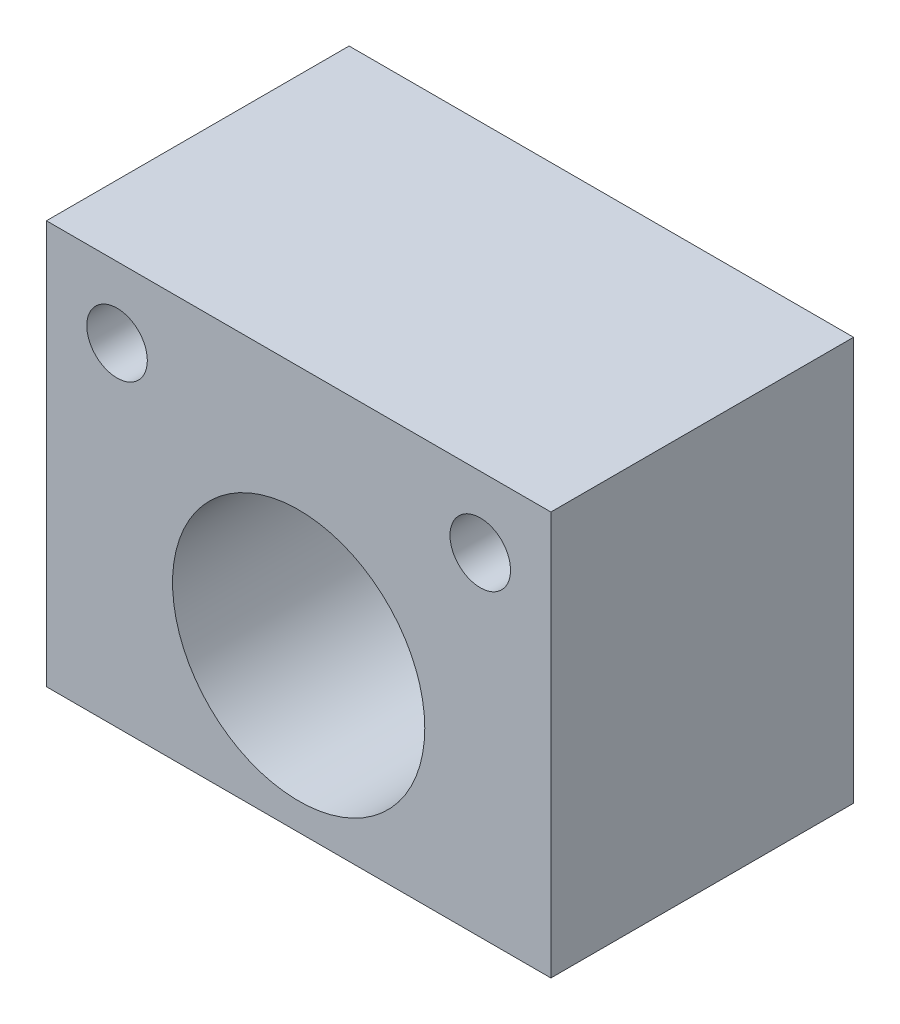
ISO-10303-21;
HEADER;
FILE_DESCRIPTION(('STEP AP214'),'2;1');
FILE_NAME('part.step','',(''),(''),'','','');
FILE_SCHEMA(('AUTOMOTIVE_DESIGN { 1 0 10303 214 1 1 1 1 }'));
ENDSEC;
DATA;
#1=APPLICATION_CONTEXT('core data for automotive mechanical design processes');
#2=APPLICATION_PROTOCOL_DEFINITION('international standard','automotive_design',2000,#1);
#3=PRODUCT_CONTEXT('',#1,'mechanical');
#4=PRODUCT('Part','Part','',(#3));
#5=PRODUCT_RELATED_PRODUCT_CATEGORY('part','',(#4));
#6=PRODUCT_DEFINITION_FORMATION('','',#4);
#7=PRODUCT_DEFINITION_CONTEXT('part definition',#1,'design');
#8=PRODUCT_DEFINITION('design','',#6,#7);
#9=PRODUCT_DEFINITION_SHAPE('','',#8);
#10=(LENGTH_UNIT() NAMED_UNIT(*) SI_UNIT(.MILLI.,.METRE.));
#11=(NAMED_UNIT(*) PLANE_ANGLE_UNIT() SI_UNIT($,.RADIAN.));
#12=(NAMED_UNIT(*) SI_UNIT($,.STERADIAN.) SOLID_ANGLE_UNIT());
#13=UNCERTAINTY_MEASURE_WITH_UNIT(LENGTH_MEASURE(1.E-05),#10,'distance_accuracy_value','');
#14=(GEOMETRIC_REPRESENTATION_CONTEXT(3) GLOBAL_UNCERTAINTY_ASSIGNED_CONTEXT((#13)) GLOBAL_UNIT_ASSIGNED_CONTEXT((#10,
#11,#12)) REPRESENTATION_CONTEXT('',''));
#15=CARTESIAN_POINT('',(0.,0.,0.));
#16=DIRECTION('',(0.,0.,1.));
#17=DIRECTION('',(1.,0.,0.));
#18=AXIS2_PLACEMENT_3D('',#15,#16,#17);
#19=CARTESIAN_POINT('',(0.,0.,30.));
#20=DIRECTION('',(0.,0.,1.));
#21=DIRECTION('',(1.,0.,0.));
#22=AXIS2_PLACEMENT_3D('',#19,#20,#21);
#23=PLANE('',#22);
#24=CARTESIAN_POINT('',(0.,-4.80905732372613,30.));
#25=DIRECTION('',(0.,0.,1.));
#26=DIRECTION('',(1.,0.,0.));
#27=AXIS2_PLACEMENT_3D('',#24,#25,#26);
#28=CIRCLE('',#27,12.5);
#29=CARTESIAN_POINT('',(12.5,-4.80905732372613,30.));
#30=VERTEX_POINT('',#29);
#31=EDGE_CURVE('E123',#30,#30,#28,.T.);
#32=ORIENTED_EDGE('',*,*,#31,.F.);
#33=EDGE_LOOP('',(#32));
#34=FACE_BOUND('',#33,.T.);
#35=CARTESIAN_POINT('',(18.,12.9999999999998,30.));
#36=DIRECTION('',(0.,0.,1.));
#37=DIRECTION('',(-1.,0.,0.));
#38=AXIS2_PLACEMENT_3D('',#35,#36,#37);
#39=CIRCLE('',#38,3.);
#40=CARTESIAN_POINT('',(15.,12.9999999999998,30.));
#41=VERTEX_POINT('',#40);
#42=EDGE_CURVE('E120',#41,#41,#39,.T.);
#43=ORIENTED_EDGE('',*,*,#42,.F.);
#44=EDGE_LOOP('',(#43));
#45=FACE_BOUND('',#44,.T.);
#46=CARTESIAN_POINT('',(-18.,13.,30.));
#47=DIRECTION('',(0.,0.,1.));
#48=DIRECTION('',(1.,0.,0.));
#49=AXIS2_PLACEMENT_3D('',#46,#47,#48);
#50=CIRCLE('',#49,3.);
#51=CARTESIAN_POINT('',(-15.,13.,30.));
#52=VERTEX_POINT('',#51);
#53=EDGE_CURVE('E114',#52,#52,#50,.T.);
#54=ORIENTED_EDGE('',*,*,#53,.F.);
#55=EDGE_LOOP('',(#54));
#56=FACE_BOUND('',#55,.T.);
#57=DIRECTION('',(0.,1.,0.));
#58=VECTOR('',#57,1.);
#59=CARTESIAN_POINT('',(25.,20.,30.));
#60=LINE('',#59,#58);
#61=CARTESIAN_POINT('',(25.,-20.,30.));
#62=VERTEX_POINT('',#61);
#63=CARTESIAN_POINT('',(25.,20.,30.));
#64=VERTEX_POINT('',#63);
#65=EDGE_CURVE('E88',#62,#64,#60,.T.);
#66=ORIENTED_EDGE('',*,*,#65,.T.);
#67=DIRECTION('',(-1.,0.,0.));
#68=VECTOR('',#67,1.);
#69=CARTESIAN_POINT('',(-25.,20.,30.));
#70=LINE('',#69,#68);
#71=CARTESIAN_POINT('',(-25.,20.,30.));
#72=VERTEX_POINT('',#71);
#73=EDGE_CURVE('E84',#64,#72,#70,.T.);
#74=ORIENTED_EDGE('',*,*,#73,.T.);
#75=DIRECTION('',(0.,-1.,0.));
#76=VECTOR('',#75,1.);
#77=CARTESIAN_POINT('',(-25.,20.,30.));
#78=LINE('',#77,#76);
#79=CARTESIAN_POINT('',(-25.,-20.,30.));
#80=VERTEX_POINT('',#79);
#81=EDGE_CURVE('E86',#72,#80,#78,.T.);
#82=ORIENTED_EDGE('',*,*,#81,.T.);
#83=DIRECTION('',(1.,0.,0.));
#84=VECTOR('',#83,1.);
#85=CARTESIAN_POINT('',(-25.,-20.,30.));
#86=LINE('',#85,#84);
#87=EDGE_CURVE('E54',#80,#62,#86,.T.);
#88=ORIENTED_EDGE('',*,*,#87,.T.);
#89=EDGE_LOOP('',(#66,#74,#82,#88));
#90=FACE_BOUND('',#89,.T.);
#91=ADVANCED_FACE('F37',(#34,#45,#56,#90),#23,.T.);
#92=CARTESIAN_POINT('',(0.,0.,0.));
#93=DIRECTION('',(0.,0.,1.));
#94=DIRECTION('',(1.,0.,0.));
#95=AXIS2_PLACEMENT_3D('',#92,#93,#94);
#96=PLANE('',#95);
#97=CARTESIAN_POINT('',(0.,-4.80905732372613,0.));
#98=DIRECTION('',(0.,0.,1.));
#99=DIRECTION('',(1.,0.,0.));
#100=AXIS2_PLACEMENT_3D('',#97,#98,#99);
#101=CIRCLE('',#100,12.5);
#102=CARTESIAN_POINT('',(12.5,-4.80905732372613,0.));
#103=VERTEX_POINT('',#102);
#104=EDGE_CURVE('E128',#103,#103,#101,.T.);
#105=ORIENTED_EDGE('',*,*,#104,.T.);
#106=EDGE_LOOP('',(#105));
#107=FACE_BOUND('',#106,.T.);
#108=CARTESIAN_POINT('',(18.,12.9999999999998,0.));
#109=DIRECTION('',(0.,0.,1.));
#110=DIRECTION('',(-1.,0.,0.));
#111=AXIS2_PLACEMENT_3D('',#108,#109,#110);
#112=CIRCLE('',#111,3.);
#113=CARTESIAN_POINT('',(15.,12.9999999999998,0.));
#114=VERTEX_POINT('',#113);
#115=EDGE_CURVE('E117',#114,#114,#112,.T.);
#116=ORIENTED_EDGE('',*,*,#115,.T.);
#117=EDGE_LOOP('',(#116));
#118=FACE_BOUND('',#117,.T.);
#119=CARTESIAN_POINT('',(-18.,13.,0.));
#120=DIRECTION('',(0.,0.,1.));
#121=DIRECTION('',(1.,0.,0.));
#122=AXIS2_PLACEMENT_3D('',#119,#120,#121);
#123=CIRCLE('',#122,3.);
#124=CARTESIAN_POINT('',(-15.,13.,0.));
#125=VERTEX_POINT('',#124);
#126=EDGE_CURVE('E103',#125,#125,#123,.T.);
#127=ORIENTED_EDGE('',*,*,#126,.T.);
#128=EDGE_LOOP('',(#127));
#129=FACE_BOUND('',#128,.T.);
#130=DIRECTION('',(0.,1.,0.));
#131=VECTOR('',#130,1.);
#132=CARTESIAN_POINT('',(25.,20.,0.));
#133=LINE('',#132,#131);
#134=CARTESIAN_POINT('',(25.,-20.,0.));
#135=VERTEX_POINT('',#134);
#136=CARTESIAN_POINT('',(25.,20.,0.));
#137=VERTEX_POINT('',#136);
#138=EDGE_CURVE('E100',#135,#137,#133,.T.);
#139=ORIENTED_EDGE('',*,*,#138,.F.);
#140=DIRECTION('',(1.,0.,0.));
#141=VECTOR('',#140,1.);
#142=CARTESIAN_POINT('',(-25.,-20.,0.));
#143=LINE('',#142,#141);
#144=CARTESIAN_POINT('',(-25.,-20.,0.));
#145=VERTEX_POINT('',#144);
#146=EDGE_CURVE('E77',#145,#135,#143,.T.);
#147=ORIENTED_EDGE('',*,*,#146,.F.);
#148=DIRECTION('',(0.,-1.,0.));
#149=VECTOR('',#148,1.);
#150=CARTESIAN_POINT('',(-25.,20.,0.));
#151=LINE('',#150,#149);
#152=CARTESIAN_POINT('',(-25.,20.,0.));
#153=VERTEX_POINT('',#152);
#154=EDGE_CURVE('E71',#153,#145,#151,.T.);
#155=ORIENTED_EDGE('',*,*,#154,.F.);
#156=DIRECTION('',(-1.,0.,0.));
#157=VECTOR('',#156,1.);
#158=CARTESIAN_POINT('',(-25.,20.,0.));
#159=LINE('',#158,#157);
#160=EDGE_CURVE('E92',#137,#153,#159,.T.);
#161=ORIENTED_EDGE('',*,*,#160,.F.);
#162=EDGE_LOOP('',(#139,#147,#155,#161));
#163=FACE_BOUND('',#162,.T.);
#164=ADVANCED_FACE('F111',(#107,#118,#129,#163),#96,.F.);
#165=CARTESIAN_POINT('',(25.,20.,30.));
#166=DIRECTION('',(-1.,0.,0.));
#167=DIRECTION('',(0.,-1.,0.));
#168=AXIS2_PLACEMENT_3D('',#165,#166,#167);
#169=PLANE('',#168);
#170=ORIENTED_EDGE('',*,*,#138,.T.);
#171=DIRECTION('',(0.,0.,-1.));
#172=VECTOR('',#171,1.);
#173=CARTESIAN_POINT('',(25.,20.,30.));
#174=LINE('',#173,#172);
#175=EDGE_CURVE('E12',#64,#137,#174,.T.);
#176=ORIENTED_EDGE('',*,*,#175,.F.);
#177=ORIENTED_EDGE('',*,*,#65,.F.);
#178=DIRECTION('',(0.,0.,-1.));
#179=VECTOR('',#178,1.);
#180=CARTESIAN_POINT('',(25.,-20.,30.));
#181=LINE('',#180,#179);
#182=EDGE_CURVE('E96',#62,#135,#181,.T.);
#183=ORIENTED_EDGE('',*,*,#182,.T.);
#184=EDGE_LOOP('',(#170,#176,#177,#183));
#185=FACE_BOUND('',#184,.T.);
#186=ADVANCED_FACE('F39',(#185),#169,.F.);
#187=CARTESIAN_POINT('',(-25.,20.,30.));
#188=DIRECTION('',(0.,-1.,0.));
#189=DIRECTION('',(0.,0.,-1.));
#190=AXIS2_PLACEMENT_3D('',#187,#188,#189);
#191=PLANE('',#190);
#192=ORIENTED_EDGE('',*,*,#160,.T.);
#193=DIRECTION('',(0.,0.,-1.));
#194=VECTOR('',#193,1.);
#195=CARTESIAN_POINT('',(-25.,20.,30.));
#196=LINE('',#195,#194);
#197=EDGE_CURVE('E46',#72,#153,#196,.T.);
#198=ORIENTED_EDGE('',*,*,#197,.F.);
#199=ORIENTED_EDGE('',*,*,#73,.F.);
#200=ORIENTED_EDGE('',*,*,#175,.T.);
#201=EDGE_LOOP('',(#192,#198,#199,#200));
#202=FACE_BOUND('',#201,.T.);
#203=ADVANCED_FACE('F91',(#202),#191,.F.);
#204=CARTESIAN_POINT('',(-25.,20.,30.));
#205=DIRECTION('',(1.,0.,0.));
#206=DIRECTION('',(0.,1.,0.));
#207=AXIS2_PLACEMENT_3D('',#204,#205,#206);
#208=PLANE('',#207);
#209=ORIENTED_EDGE('',*,*,#154,.T.);
#210=DIRECTION('',(0.,0.,-1.));
#211=VECTOR('',#210,1.);
#212=CARTESIAN_POINT('',(-25.,-20.,30.));
#213=LINE('',#212,#211);
#214=EDGE_CURVE('E93',#80,#145,#213,.T.);
#215=ORIENTED_EDGE('',*,*,#214,.F.);
#216=ORIENTED_EDGE('',*,*,#81,.F.);
#217=ORIENTED_EDGE('',*,*,#197,.T.);
#218=EDGE_LOOP('',(#209,#215,#216,#217));
#219=FACE_BOUND('',#218,.T.);
#220=ADVANCED_FACE('F94',(#219),#208,.F.);
#221=CARTESIAN_POINT('',(-25.,-20.,30.));
#222=DIRECTION('',(0.,1.,0.));
#223=DIRECTION('',(0.,0.,1.));
#224=AXIS2_PLACEMENT_3D('',#221,#222,#223);
#225=PLANE('',#224);
#226=ORIENTED_EDGE('',*,*,#146,.T.);
#227=ORIENTED_EDGE('',*,*,#182,.F.);
#228=ORIENTED_EDGE('',*,*,#87,.F.);
#229=ORIENTED_EDGE('',*,*,#214,.T.);
#230=EDGE_LOOP('',(#226,#227,#228,#229));
#231=FACE_BOUND('',#230,.T.);
#232=ADVANCED_FACE('F108',(#231),#225,.F.);
#233=CARTESIAN_POINT('',(-18.,13.,0.));
#234=DIRECTION('',(0.,0.,1.));
#235=DIRECTION('',(1.,0.,0.));
#236=AXIS2_PLACEMENT_3D('',#233,#234,#235);
#237=CYLINDRICAL_SURFACE('',#236,3.);
#238=ORIENTED_EDGE('',*,*,#126,.F.);
#239=EDGE_LOOP('',(#238));
#240=FACE_BOUND('',#239,.T.);
#241=ORIENTED_EDGE('',*,*,#53,.T.);
#242=EDGE_LOOP('',(#241));
#243=FACE_BOUND('',#242,.T.);
#244=ADVANCED_FACE('F142',(#240,#243),#237,.F.);
#245=CARTESIAN_POINT('',(18.,12.9999999999998,0.));
#246=DIRECTION('',(0.,0.,1.));
#247=DIRECTION('',(1.,0.,0.));
#248=AXIS2_PLACEMENT_3D('',#245,#246,#247);
#249=CYLINDRICAL_SURFACE('',#248,3.);
#250=ORIENTED_EDGE('',*,*,#115,.F.);
#251=EDGE_LOOP('',(#250));
#252=FACE_BOUND('',#251,.T.);
#253=ORIENTED_EDGE('',*,*,#42,.T.);
#254=EDGE_LOOP('',(#253));
#255=FACE_BOUND('',#254,.T.);
#256=ADVANCED_FACE('F136',(#252,#255),#249,.F.);
#257=CARTESIAN_POINT('',(0.,-4.80905732372613,-35.3553390593274));
#258=DIRECTION('',(0.,0.,1.));
#259=DIRECTION('',(1.,0.,0.));
#260=AXIS2_PLACEMENT_3D('',#257,#258,#259);
#261=CYLINDRICAL_SURFACE('',#260,12.5);
#262=ORIENTED_EDGE('',*,*,#31,.T.);
#263=EDGE_LOOP('',(#262));
#264=FACE_BOUND('',#263,.T.);
#265=ORIENTED_EDGE('',*,*,#104,.F.);
#266=EDGE_LOOP('',(#265));
#267=FACE_BOUND('',#266,.T.);
#268=ADVANCED_FACE('F134',(#264,#267),#261,.F.);
#269=CLOSED_SHELL('',(#91,#164,#186,#203,#220,#232,#244,#256,#268));
#270=MANIFOLD_SOLID_BREP('B2',#269);
#271=ADVANCED_BREP_SHAPE_REPRESENTATION('',(#18,#270),#14);
#272=SHAPE_DEFINITION_REPRESENTATION(#9,#271);
ENDSEC;
END-ISO-10303-21;
